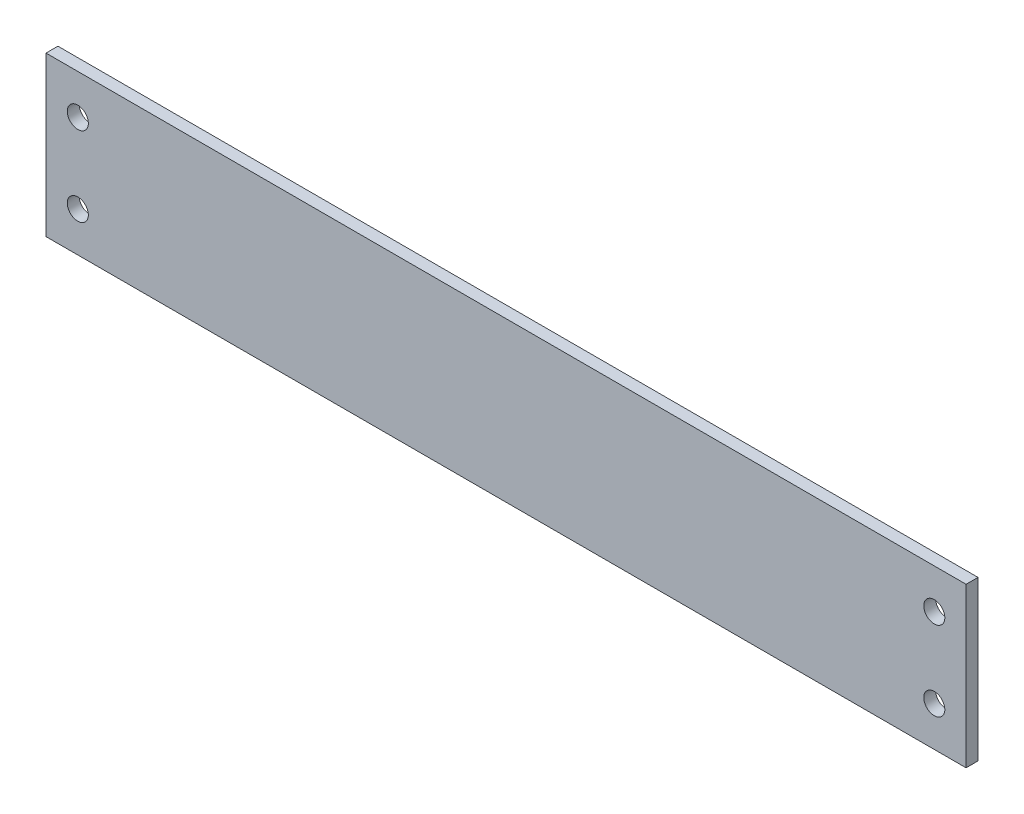
ISO-10303-21;
HEADER;
FILE_DESCRIPTION(('STEP AP214'),'2;1');
FILE_NAME('part.step','',(''),(''),'','','');
FILE_SCHEMA(('AUTOMOTIVE_DESIGN { 1 0 10303 214 1 1 1 1 }'));
ENDSEC;
DATA;
#1=APPLICATION_CONTEXT('core data for automotive mechanical design processes');
#2=APPLICATION_PROTOCOL_DEFINITION('international standard','automotive_design',2000,#1);
#3=PRODUCT_CONTEXT('',#1,'mechanical');
#4=PRODUCT('Part','Part','',(#3));
#5=PRODUCT_RELATED_PRODUCT_CATEGORY('part','',(#4));
#6=PRODUCT_DEFINITION_FORMATION('','',#4);
#7=PRODUCT_DEFINITION_CONTEXT('part definition',#1,'design');
#8=PRODUCT_DEFINITION('design','',#6,#7);
#9=PRODUCT_DEFINITION_SHAPE('','',#8);
#10=(LENGTH_UNIT() NAMED_UNIT(*) SI_UNIT(.MILLI.,.METRE.));
#11=(NAMED_UNIT(*) PLANE_ANGLE_UNIT() SI_UNIT($,.RADIAN.));
#12=(NAMED_UNIT(*) SI_UNIT($,.STERADIAN.) SOLID_ANGLE_UNIT());
#13=UNCERTAINTY_MEASURE_WITH_UNIT(LENGTH_MEASURE(1.E-05),#10,'distance_accuracy_value','');
#14=(GEOMETRIC_REPRESENTATION_CONTEXT(3) GLOBAL_UNCERTAINTY_ASSIGNED_CONTEXT((#13)) GLOBAL_UNIT_ASSIGNED_CONTEXT((#10,
#11,#12)) REPRESENTATION_CONTEXT('',''));
#15=CARTESIAN_POINT('',(0.,0.,0.));
#16=DIRECTION('',(0.,0.,1.));
#17=DIRECTION('',(1.,0.,0.));
#18=AXIS2_PLACEMENT_3D('',#15,#16,#17);
#19=CARTESIAN_POINT('',(-22.,36.75,-3.));
#20=DIRECTION('',(0.,1.,0.));
#21=DIRECTION('',(-1.,0.,0.));
#22=AXIS2_PLACEMENT_3D('',#19,#20,#21);
#23=PLANE('',#22);
#24=DIRECTION('',(-1.,0.,0.));
#25=VECTOR('',#24,1.);
#26=CARTESIAN_POINT('',(-22.,36.75,0.));
#27=LINE('',#26,#25);
#28=CARTESIAN_POINT('',(209.5,36.75,0.));
#29=VERTEX_POINT('',#28);
#30=CARTESIAN_POINT('',(-22.,36.75,0.));
#31=VERTEX_POINT('',#30);
#32=EDGE_CURVE('E100',#29,#31,#27,.T.);
#33=ORIENTED_EDGE('',*,*,#32,.F.);
#34=DIRECTION('',(0.,0.,1.));
#35=VECTOR('',#34,1.);
#36=CARTESIAN_POINT('',(209.5,36.75,-3.));
#37=LINE('',#36,#35);
#38=CARTESIAN_POINT('',(209.5,36.75,-3.));
#39=VERTEX_POINT('',#38);
#40=EDGE_CURVE('E11',#39,#29,#37,.T.);
#41=ORIENTED_EDGE('',*,*,#40,.F.);
#42=DIRECTION('',(-1.,0.,0.));
#43=VECTOR('',#42,1.);
#44=CARTESIAN_POINT('',(-22.,36.75,-3.));
#45=LINE('',#44,#43);
#46=CARTESIAN_POINT('',(-22.,36.75,-3.));
#47=VERTEX_POINT('',#46);
#48=EDGE_CURVE('E93',#39,#47,#45,.T.);
#49=ORIENTED_EDGE('',*,*,#48,.T.);
#50=DIRECTION('',(0.,0.,1.));
#51=VECTOR('',#50,1.);
#52=CARTESIAN_POINT('',(-22.,36.75,-3.));
#53=LINE('',#52,#51);
#54=EDGE_CURVE('E38',#47,#31,#53,.T.);
#55=ORIENTED_EDGE('',*,*,#54,.T.);
#56=EDGE_LOOP('',(#33,#41,#49,#55));
#57=FACE_BOUND('',#56,.T.);
#58=ADVANCED_FACE('F35',(#57),#23,.T.);
#59=CARTESIAN_POINT('',(209.5,36.75,-3.));
#60=DIRECTION('',(1.,0.,0.));
#61=DIRECTION('',(0.,0.,-1.));
#62=AXIS2_PLACEMENT_3D('',#59,#60,#61);
#63=PLANE('',#62);
#64=DIRECTION('',(0.,1.,0.));
#65=VECTOR('',#64,1.);
#66=CARTESIAN_POINT('',(209.5,36.75,0.));
#67=LINE('',#66,#65);
#68=CARTESIAN_POINT('',(209.5,-3.25,0.));
#69=VERTEX_POINT('',#68);
#70=EDGE_CURVE('E95',#69,#29,#67,.T.);
#71=ORIENTED_EDGE('',*,*,#70,.F.);
#72=DIRECTION('',(0.,0.,1.));
#73=VECTOR('',#72,1.);
#74=CARTESIAN_POINT('',(209.5,-3.25,-3.));
#75=LINE('',#74,#73);
#76=CARTESIAN_POINT('',(209.5,-3.25,-3.));
#77=VERTEX_POINT('',#76);
#78=EDGE_CURVE('E44',#77,#69,#75,.T.);
#79=ORIENTED_EDGE('',*,*,#78,.F.);
#80=DIRECTION('',(0.,1.,0.));
#81=VECTOR('',#80,1.);
#82=CARTESIAN_POINT('',(209.5,36.75,-3.));
#83=LINE('',#82,#81);
#84=EDGE_CURVE('E90',#77,#39,#83,.T.);
#85=ORIENTED_EDGE('',*,*,#84,.T.);
#86=ORIENTED_EDGE('',*,*,#40,.T.);
#87=EDGE_LOOP('',(#71,#79,#85,#86));
#88=FACE_BOUND('',#87,.T.);
#89=ADVANCED_FACE('F111',(#88),#63,.T.);
#90=CARTESIAN_POINT('',(-22.,-3.25,-3.));
#91=DIRECTION('',(0.,-1.,0.));
#92=DIRECTION('',(0.,0.,-1.));
#93=AXIS2_PLACEMENT_3D('',#90,#91,#92);
#94=PLANE('',#93);
#95=DIRECTION('',(1.,0.,0.));
#96=VECTOR('',#95,1.);
#97=CARTESIAN_POINT('',(-22.,-3.25,0.));
#98=LINE('',#97,#96);
#99=CARTESIAN_POINT('',(-22.,-3.25,0.));
#100=VERTEX_POINT('',#99);
#101=EDGE_CURVE('E85',#100,#69,#98,.T.);
#102=ORIENTED_EDGE('',*,*,#101,.F.);
#103=DIRECTION('',(0.,0.,1.));
#104=VECTOR('',#103,1.);
#105=CARTESIAN_POINT('',(-22.,-3.25,-3.));
#106=LINE('',#105,#104);
#107=CARTESIAN_POINT('',(-22.,-3.25,-3.));
#108=VERTEX_POINT('',#107);
#109=EDGE_CURVE('E80',#108,#100,#106,.T.);
#110=ORIENTED_EDGE('',*,*,#109,.F.);
#111=DIRECTION('',(1.,0.,0.));
#112=VECTOR('',#111,1.);
#113=CARTESIAN_POINT('',(-22.,-3.25,-3.));
#114=LINE('',#113,#112);
#115=EDGE_CURVE('E83',#108,#77,#114,.T.);
#116=ORIENTED_EDGE('',*,*,#115,.T.);
#117=ORIENTED_EDGE('',*,*,#78,.T.);
#118=EDGE_LOOP('',(#102,#110,#116,#117));
#119=FACE_BOUND('',#118,.T.);
#120=ADVANCED_FACE('F82',(#119),#94,.T.);
#121=CARTESIAN_POINT('',(-22.,36.75,-3.));
#122=DIRECTION('',(-1.,0.,0.));
#123=DIRECTION('',(0.,0.,1.));
#124=AXIS2_PLACEMENT_3D('',#121,#122,#123);
#125=PLANE('',#124);
#126=DIRECTION('',(0.,-1.,0.));
#127=VECTOR('',#126,1.);
#128=CARTESIAN_POINT('',(-22.,36.75,0.));
#129=LINE('',#128,#127);
#130=EDGE_CURVE('E103',#31,#100,#129,.T.);
#131=ORIENTED_EDGE('',*,*,#130,.F.);
#132=ORIENTED_EDGE('',*,*,#54,.F.);
#133=DIRECTION('',(0.,-1.,0.));
#134=VECTOR('',#133,1.);
#135=CARTESIAN_POINT('',(-22.,36.75,-3.));
#136=LINE('',#135,#134);
#137=EDGE_CURVE('E89',#47,#108,#136,.T.);
#138=ORIENTED_EDGE('',*,*,#137,.T.);
#139=ORIENTED_EDGE('',*,*,#109,.T.);
#140=EDGE_LOOP('',(#131,#132,#138,#139));
#141=FACE_BOUND('',#140,.T.);
#142=ADVANCED_FACE('F92',(#141),#125,.T.);
#143=CARTESIAN_POINT('',(0.,0.,-3.));
#144=DIRECTION('',(0.,0.,-1.));
#145=DIRECTION('',(-1.,0.,0.));
#146=AXIS2_PLACEMENT_3D('',#143,#144,#145);
#147=PLANE('',#146);
#148=CARTESIAN_POINT('',(201.5,6.75,-3.));
#149=DIRECTION('',(0.,0.,1.));
#150=DIRECTION('',(1.,0.,0.));
#151=AXIS2_PLACEMENT_3D('',#148,#149,#150);
#152=CIRCLE('',#151,2.65000000000001);
#153=CARTESIAN_POINT('',(204.15,6.75,-3.));
#154=VERTEX_POINT('',#153);
#155=EDGE_CURVE('E152',#154,#154,#152,.T.);
#156=ORIENTED_EDGE('',*,*,#155,.T.);
#157=EDGE_LOOP('',(#156));
#158=FACE_BOUND('',#157,.T.);
#159=CARTESIAN_POINT('',(201.5,26.75,-3.));
#160=DIRECTION('',(0.,0.,1.));
#161=DIRECTION('',(1.,0.,0.));
#162=AXIS2_PLACEMENT_3D('',#159,#160,#161);
#163=CIRCLE('',#162,2.65000000000001);
#164=CARTESIAN_POINT('',(204.15,26.75,-3.));
#165=VERTEX_POINT('',#164);
#166=EDGE_CURVE('E160',#165,#165,#163,.T.);
#167=ORIENTED_EDGE('',*,*,#166,.T.);
#168=EDGE_LOOP('',(#167));
#169=FACE_BOUND('',#168,.T.);
#170=CARTESIAN_POINT('',(-14.,26.75,-3.));
#171=DIRECTION('',(0.,0.,1.));
#172=DIRECTION('',(1.,0.,0.));
#173=AXIS2_PLACEMENT_3D('',#170,#171,#172);
#174=CIRCLE('',#173,2.65);
#175=CARTESIAN_POINT('',(-11.35,26.75,-3.));
#176=VERTEX_POINT('',#175);
#177=EDGE_CURVE('E166',#176,#176,#174,.T.);
#178=ORIENTED_EDGE('',*,*,#177,.T.);
#179=EDGE_LOOP('',(#178));
#180=FACE_BOUND('',#179,.T.);
#181=CARTESIAN_POINT('',(-14.,6.74999999999999,-3.));
#182=DIRECTION('',(0.,0.,1.));
#183=DIRECTION('',(1.,0.,0.));
#184=AXIS2_PLACEMENT_3D('',#181,#182,#183);
#185=CIRCLE('',#184,2.65);
#186=CARTESIAN_POINT('',(-11.35,6.74999999999999,-3.));
#187=VERTEX_POINT('',#186);
#188=EDGE_CURVE('E104',#187,#187,#185,.T.);
#189=ORIENTED_EDGE('',*,*,#188,.T.);
#190=EDGE_LOOP('',(#189));
#191=FACE_BOUND('',#190,.T.);
#192=ORIENTED_EDGE('',*,*,#48,.F.);
#193=ORIENTED_EDGE('',*,*,#84,.F.);
#194=ORIENTED_EDGE('',*,*,#115,.F.);
#195=ORIENTED_EDGE('',*,*,#137,.F.);
#196=EDGE_LOOP('',(#192,#193,#194,#195));
#197=FACE_BOUND('',#196,.T.);
#198=ADVANCED_FACE('F88',(#158,#169,#180,#191,#197),#147,.T.);
#199=CARTESIAN_POINT('',(0.,0.,0.));
#200=DIRECTION('',(0.,0.,-1.));
#201=DIRECTION('',(-1.,0.,0.));
#202=AXIS2_PLACEMENT_3D('',#199,#200,#201);
#203=PLANE('',#202);
#204=CARTESIAN_POINT('',(201.5,6.75,0.));
#205=DIRECTION('',(0.,0.,1.));
#206=DIRECTION('',(1.,0.,0.));
#207=AXIS2_PLACEMENT_3D('',#204,#205,#206);
#208=CIRCLE('',#207,2.65000000000001);
#209=CARTESIAN_POINT('',(204.15,6.75,0.));
#210=VERTEX_POINT('',#209);
#211=EDGE_CURVE('E155',#210,#210,#208,.T.);
#212=ORIENTED_EDGE('',*,*,#211,.F.);
#213=EDGE_LOOP('',(#212));
#214=FACE_BOUND('',#213,.T.);
#215=CARTESIAN_POINT('',(201.5,26.75,0.));
#216=DIRECTION('',(0.,0.,1.));
#217=DIRECTION('',(1.,0.,0.));
#218=AXIS2_PLACEMENT_3D('',#215,#216,#217);
#219=CIRCLE('',#218,2.65000000000001);
#220=CARTESIAN_POINT('',(204.15,26.75,0.));
#221=VERTEX_POINT('',#220);
#222=EDGE_CURVE('E157',#221,#221,#219,.T.);
#223=ORIENTED_EDGE('',*,*,#222,.F.);
#224=EDGE_LOOP('',(#223));
#225=FACE_BOUND('',#224,.T.);
#226=CARTESIAN_POINT('',(-14.,26.75,0.));
#227=DIRECTION('',(0.,0.,1.));
#228=DIRECTION('',(1.,0.,0.));
#229=AXIS2_PLACEMENT_3D('',#226,#227,#228);
#230=CIRCLE('',#229,2.65);
#231=CARTESIAN_POINT('',(-11.35,26.75,0.));
#232=VERTEX_POINT('',#231);
#233=EDGE_CURVE('E163',#232,#232,#230,.T.);
#234=ORIENTED_EDGE('',*,*,#233,.F.);
#235=EDGE_LOOP('',(#234));
#236=FACE_BOUND('',#235,.T.);
#237=CARTESIAN_POINT('',(-14.,6.74999999999999,0.));
#238=DIRECTION('',(0.,0.,1.));
#239=DIRECTION('',(1.,0.,0.));
#240=AXIS2_PLACEMENT_3D('',#237,#238,#239);
#241=CIRCLE('',#240,2.65);
#242=CARTESIAN_POINT('',(-11.35,6.74999999999999,0.));
#243=VERTEX_POINT('',#242);
#244=EDGE_CURVE('E169',#243,#243,#241,.T.);
#245=ORIENTED_EDGE('',*,*,#244,.F.);
#246=EDGE_LOOP('',(#245));
#247=FACE_BOUND('',#246,.T.);
#248=ORIENTED_EDGE('',*,*,#32,.T.);
#249=ORIENTED_EDGE('',*,*,#130,.T.);
#250=ORIENTED_EDGE('',*,*,#101,.T.);
#251=ORIENTED_EDGE('',*,*,#70,.T.);
#252=EDGE_LOOP('',(#248,#249,#250,#251));
#253=FACE_BOUND('',#252,.T.);
#254=ADVANCED_FACE('F110',(#214,#225,#236,#247,#253),#203,.F.);
#255=CARTESIAN_POINT('',(-14.,6.74999999999999,-3.));
#256=DIRECTION('',(0.,0.,1.));
#257=DIRECTION('',(1.,0.,0.));
#258=AXIS2_PLACEMENT_3D('',#255,#256,#257);
#259=CYLINDRICAL_SURFACE('',#258,2.65);
#260=ORIENTED_EDGE('',*,*,#188,.F.);
#261=EDGE_LOOP('',(#260));
#262=FACE_BOUND('',#261,.T.);
#263=ORIENTED_EDGE('',*,*,#244,.T.);
#264=EDGE_LOOP('',(#263));
#265=FACE_BOUND('',#264,.T.);
#266=ADVANCED_FACE('F129',(#262,#265),#259,.F.);
#267=CARTESIAN_POINT('',(-14.,26.75,-3.));
#268=DIRECTION('',(0.,0.,1.));
#269=DIRECTION('',(1.,0.,0.));
#270=AXIS2_PLACEMENT_3D('',#267,#268,#269);
#271=CYLINDRICAL_SURFACE('',#270,2.65);
#272=ORIENTED_EDGE('',*,*,#177,.F.);
#273=EDGE_LOOP('',(#272));
#274=FACE_BOUND('',#273,.T.);
#275=ORIENTED_EDGE('',*,*,#233,.T.);
#276=EDGE_LOOP('',(#275));
#277=FACE_BOUND('',#276,.T.);
#278=ADVANCED_FACE('F136',(#274,#277),#271,.F.);
#279=CARTESIAN_POINT('',(201.5,26.75,-3.));
#280=DIRECTION('',(0.,0.,1.));
#281=DIRECTION('',(1.,0.,0.));
#282=AXIS2_PLACEMENT_3D('',#279,#280,#281);
#283=CYLINDRICAL_SURFACE('',#282,2.65000000000001);
#284=ORIENTED_EDGE('',*,*,#166,.F.);
#285=EDGE_LOOP('',(#284));
#286=FACE_BOUND('',#285,.T.);
#287=ORIENTED_EDGE('',*,*,#222,.T.);
#288=EDGE_LOOP('',(#287));
#289=FACE_BOUND('',#288,.T.);
#290=ADVANCED_FACE('F140',(#286,#289),#283,.F.);
#291=CARTESIAN_POINT('',(201.5,6.75,-3.));
#292=DIRECTION('',(0.,0.,1.));
#293=DIRECTION('',(1.,0.,0.));
#294=AXIS2_PLACEMENT_3D('',#291,#292,#293);
#295=CYLINDRICAL_SURFACE('',#294,2.65000000000001);
#296=ORIENTED_EDGE('',*,*,#155,.F.);
#297=EDGE_LOOP('',(#296));
#298=FACE_BOUND('',#297,.T.);
#299=ORIENTED_EDGE('',*,*,#211,.T.);
#300=EDGE_LOOP('',(#299));
#301=FACE_BOUND('',#300,.T.);
#302=ADVANCED_FACE('F144',(#298,#301),#295,.F.);
#303=CLOSED_SHELL('',(#58,#89,#120,#142,#198,#254,#266,#278,#290,#302));
#304=MANIFOLD_SOLID_BREP('B2',#303);
#305=ADVANCED_BREP_SHAPE_REPRESENTATION('',(#18,#304),#14);
#306=SHAPE_DEFINITION_REPRESENTATION(#9,#305);
ENDSEC;
END-ISO-10303-21;
